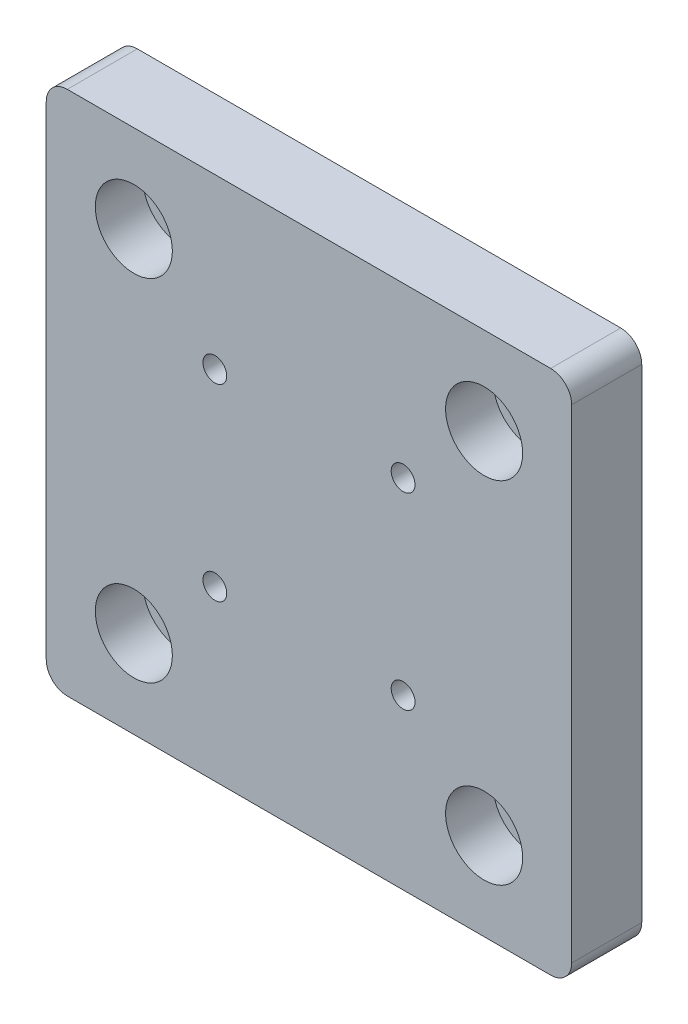
ISO-10303-21;
HEADER;
FILE_DESCRIPTION(('STEP AP214'),'2;1');
FILE_NAME('part.step','',(''),(''),'','','');
FILE_SCHEMA(('AUTOMOTIVE_DESIGN { 1 0 10303 214 1 1 1 1 }'));
ENDSEC;
DATA;
#1=APPLICATION_CONTEXT('core data for automotive mechanical design processes');
#2=APPLICATION_PROTOCOL_DEFINITION('international standard','automotive_design',2000,#1);
#3=PRODUCT_CONTEXT('',#1,'mechanical');
#4=PRODUCT('Part','Part','',(#3));
#5=PRODUCT_RELATED_PRODUCT_CATEGORY('part','',(#4));
#6=PRODUCT_DEFINITION_FORMATION('','',#4);
#7=PRODUCT_DEFINITION_CONTEXT('part definition',#1,'design');
#8=PRODUCT_DEFINITION('design','',#6,#7);
#9=PRODUCT_DEFINITION_SHAPE('','',#8);
#10=(LENGTH_UNIT() NAMED_UNIT(*) SI_UNIT(.MILLI.,.METRE.));
#11=(NAMED_UNIT(*) PLANE_ANGLE_UNIT() SI_UNIT($,.RADIAN.));
#12=(NAMED_UNIT(*) SI_UNIT($,.STERADIAN.) SOLID_ANGLE_UNIT());
#13=UNCERTAINTY_MEASURE_WITH_UNIT(LENGTH_MEASURE(1.E-05),#10,'distance_accuracy_value','');
#14=(GEOMETRIC_REPRESENTATION_CONTEXT(3) GLOBAL_UNCERTAINTY_ASSIGNED_CONTEXT((#13)) GLOBAL_UNIT_ASSIGNED_CONTEXT((#10,
#11,#12)) REPRESENTATION_CONTEXT('',''));
#15=CARTESIAN_POINT('',(0.,0.,0.));
#16=DIRECTION('',(0.,0.,1.));
#17=DIRECTION('',(1.,0.,0.));
#18=AXIS2_PLACEMENT_3D('',#15,#16,#17);
#19=CARTESIAN_POINT('',(37.5,37.5,10.));
#20=DIRECTION('',(-1.,0.,0.));
#21=DIRECTION('',(0.,0.,1.));
#22=AXIS2_PLACEMENT_3D('',#19,#20,#21);
#23=PLANE('',#22);
#24=DIRECTION('',(0.,1.,0.));
#25=VECTOR('',#24,1.);
#26=CARTESIAN_POINT('',(37.5,37.5,10.));
#27=LINE('',#26,#25);
#28=CARTESIAN_POINT('',(37.5,-34.5,10.));
#29=VERTEX_POINT('',#28);
#30=CARTESIAN_POINT('',(37.5,34.5,10.));
#31=VERTEX_POINT('',#30);
#32=EDGE_CURVE('E129',#29,#31,#27,.T.);
#33=ORIENTED_EDGE('',*,*,#32,.F.);
#34=DIRECTION('',(0.,0.,-1.));
#35=VECTOR('',#34,1.);
#36=CARTESIAN_POINT('',(37.5,-34.5,10.));
#37=LINE('',#36,#35);
#38=CARTESIAN_POINT('',(37.5,-34.5,0.));
#39=VERTEX_POINT('',#38);
#40=EDGE_CURVE('E114',#29,#39,#37,.T.);
#41=ORIENTED_EDGE('',*,*,#40,.T.);
#42=DIRECTION('',(0.,1.,0.));
#43=VECTOR('',#42,1.);
#44=CARTESIAN_POINT('',(37.5,37.5,0.));
#45=LINE('',#44,#43);
#46=CARTESIAN_POINT('',(37.5,34.5,0.));
#47=VERTEX_POINT('',#46);
#48=EDGE_CURVE('E126',#39,#47,#45,.T.);
#49=ORIENTED_EDGE('',*,*,#48,.T.);
#50=DIRECTION('',(0.,0.,-1.));
#51=VECTOR('',#50,1.);
#52=CARTESIAN_POINT('',(37.5,34.5,10.));
#53=LINE('',#52,#51);
#54=EDGE_CURVE('E131',#47,#31,#53,.F.);
#55=ORIENTED_EDGE('',*,*,#54,.T.);
#56=EDGE_LOOP('',(#33,#41,#49,#55));
#57=FACE_BOUND('',#56,.T.);
#58=ADVANCED_FACE('F43',(#57),#23,.F.);
#59=CARTESIAN_POINT('',(-37.5,37.5,10.));
#60=DIRECTION('',(0.,-1.,0.));
#61=DIRECTION('',(0.,0.,-1.));
#62=AXIS2_PLACEMENT_3D('',#59,#60,#61);
#63=PLANE('',#62);
#64=DIRECTION('',(-1.,0.,0.));
#65=VECTOR('',#64,1.);
#66=CARTESIAN_POINT('',(-37.5,37.5,10.));
#67=LINE('',#66,#65);
#68=CARTESIAN_POINT('',(34.5,37.5,10.));
#69=VERTEX_POINT('',#68);
#70=CARTESIAN_POINT('',(-34.5,37.5,10.));
#71=VERTEX_POINT('',#70);
#72=EDGE_CURVE('E188',#69,#71,#67,.T.);
#73=ORIENTED_EDGE('',*,*,#72,.F.);
#74=DIRECTION('',(0.,0.,-1.));
#75=VECTOR('',#74,1.);
#76=CARTESIAN_POINT('',(34.5,37.5,10.));
#77=LINE('',#76,#75);
#78=CARTESIAN_POINT('',(34.5,37.5,0.));
#79=VERTEX_POINT('',#78);
#80=EDGE_CURVE('E11',#69,#79,#77,.T.);
#81=ORIENTED_EDGE('',*,*,#80,.T.);
#82=DIRECTION('',(-1.,0.,0.));
#83=VECTOR('',#82,1.);
#84=CARTESIAN_POINT('',(-37.5,37.5,0.));
#85=LINE('',#84,#83);
#86=CARTESIAN_POINT('',(-34.5,37.5,0.));
#87=VERTEX_POINT('',#86);
#88=EDGE_CURVE('E136',#79,#87,#85,.T.);
#89=ORIENTED_EDGE('',*,*,#88,.T.);
#90=DIRECTION('',(0.,0.,-1.));
#91=VECTOR('',#90,1.);
#92=CARTESIAN_POINT('',(-34.5,37.5,10.));
#93=LINE('',#92,#91);
#94=EDGE_CURVE('E51',#87,#71,#93,.F.);
#95=ORIENTED_EDGE('',*,*,#94,.T.);
#96=EDGE_LOOP('',(#73,#81,#89,#95));
#97=FACE_BOUND('',#96,.T.);
#98=ADVANCED_FACE('F187',(#97),#63,.F.);
#99=CARTESIAN_POINT('',(-37.5,37.5,10.));
#100=DIRECTION('',(1.,0.,0.));
#101=DIRECTION('',(0.,1.,0.));
#102=AXIS2_PLACEMENT_3D('',#99,#100,#101);
#103=PLANE('',#102);
#104=DIRECTION('',(0.,-1.,0.));
#105=VECTOR('',#104,1.);
#106=CARTESIAN_POINT('',(-37.5,37.5,0.));
#107=LINE('',#106,#105);
#108=CARTESIAN_POINT('',(-37.5,34.5,0.));
#109=VERTEX_POINT('',#108);
#110=CARTESIAN_POINT('',(-37.5,-34.5,0.));
#111=VERTEX_POINT('',#110);
#112=EDGE_CURVE('E140',#109,#111,#107,.T.);
#113=ORIENTED_EDGE('',*,*,#112,.T.);
#114=DIRECTION('',(0.,0.,-1.));
#115=VECTOR('',#114,1.);
#116=CARTESIAN_POINT('',(-37.5,-34.5,10.));
#117=LINE('',#116,#115);
#118=CARTESIAN_POINT('',(-37.5,-34.5,10.));
#119=VERTEX_POINT('',#118);
#120=EDGE_CURVE('E58',#111,#119,#117,.F.);
#121=ORIENTED_EDGE('',*,*,#120,.T.);
#122=DIRECTION('',(0.,-1.,0.));
#123=VECTOR('',#122,1.);
#124=CARTESIAN_POINT('',(-37.5,37.5,10.));
#125=LINE('',#124,#123);
#126=CARTESIAN_POINT('',(-37.5,34.5,10.));
#127=VERTEX_POINT('',#126);
#128=EDGE_CURVE('E194',#127,#119,#125,.T.);
#129=ORIENTED_EDGE('',*,*,#128,.F.);
#130=DIRECTION('',(0.,0.,-1.));
#131=VECTOR('',#130,1.);
#132=CARTESIAN_POINT('',(-37.5,34.5,10.));
#133=LINE('',#132,#131);
#134=EDGE_CURVE('E181',#127,#109,#133,.T.);
#135=ORIENTED_EDGE('',*,*,#134,.T.);
#136=EDGE_LOOP('',(#113,#121,#129,#135));
#137=FACE_BOUND('',#136,.T.);
#138=ADVANCED_FACE('F198',(#137),#103,.F.);
#139=CARTESIAN_POINT('',(-37.5,-37.5,10.));
#140=DIRECTION('',(0.,1.,0.));
#141=DIRECTION('',(0.,0.,1.));
#142=AXIS2_PLACEMENT_3D('',#139,#140,#141);
#143=PLANE('',#142);
#144=DIRECTION('',(1.,0.,0.));
#145=VECTOR('',#144,1.);
#146=CARTESIAN_POINT('',(-37.5,-37.5,0.));
#147=LINE('',#146,#145);
#148=CARTESIAN_POINT('',(-34.5,-37.5,0.));
#149=VERTEX_POINT('',#148);
#150=CARTESIAN_POINT('',(34.5,-37.5,0.));
#151=VERTEX_POINT('',#150);
#152=EDGE_CURVE('E150',#149,#151,#147,.T.);
#153=ORIENTED_EDGE('',*,*,#152,.T.);
#154=DIRECTION('',(0.,0.,-1.));
#155=VECTOR('',#154,1.);
#156=CARTESIAN_POINT('',(34.5,-37.5,10.));
#157=LINE('',#156,#155);
#158=CARTESIAN_POINT('',(34.5,-37.5,10.));
#159=VERTEX_POINT('',#158);
#160=EDGE_CURVE('E115',#151,#159,#157,.F.);
#161=ORIENTED_EDGE('',*,*,#160,.T.);
#162=DIRECTION('',(1.,0.,0.));
#163=VECTOR('',#162,1.);
#164=CARTESIAN_POINT('',(-37.5,-37.5,10.));
#165=LINE('',#164,#163);
#166=CARTESIAN_POINT('',(-34.5,-37.5,10.));
#167=VERTEX_POINT('',#166);
#168=EDGE_CURVE('E146',#167,#159,#165,.T.);
#169=ORIENTED_EDGE('',*,*,#168,.F.);
#170=DIRECTION('',(0.,0.,-1.));
#171=VECTOR('',#170,1.);
#172=CARTESIAN_POINT('',(-34.5,-37.5,10.));
#173=LINE('',#172,#171);
#174=EDGE_CURVE('E120',#167,#149,#173,.T.);
#175=ORIENTED_EDGE('',*,*,#174,.T.);
#176=EDGE_LOOP('',(#153,#161,#169,#175));
#177=FACE_BOUND('',#176,.T.);
#178=ADVANCED_FACE('F205',(#177),#143,.F.);
#179=CARTESIAN_POINT('',(0.,0.,10.));
#180=DIRECTION('',(0.,0.,1.));
#181=DIRECTION('',(1.,0.,0.));
#182=AXIS2_PLACEMENT_3D('',#179,#180,#181);
#183=PLANE('',#182);
#184=CARTESIAN_POINT('',(-13.4350288425444,-13.4350288425444,10.));
#185=DIRECTION('',(0.,0.,-1.));
#186=DIRECTION('',(-1.,0.,0.));
#187=AXIS2_PLACEMENT_3D('',#184,#185,#186);
#188=CIRCLE('',#187,1.7);
#189=CARTESIAN_POINT('',(-15.1350288425444,-13.4350288425444,10.));
#190=VERTEX_POINT('',#189);
#191=EDGE_CURVE('E273',#190,#190,#188,.T.);
#192=ORIENTED_EDGE('',*,*,#191,.T.);
#193=EDGE_LOOP('',(#192));
#194=FACE_BOUND('',#193,.T.);
#195=CARTESIAN_POINT('',(-13.4350288425444,13.4350288425444,10.));
#196=DIRECTION('',(0.,0.,-1.));
#197=DIRECTION('',(-1.,0.,0.));
#198=AXIS2_PLACEMENT_3D('',#195,#196,#197);
#199=CIRCLE('',#198,1.7);
#200=CARTESIAN_POINT('',(-15.1350288425444,13.4350288425444,10.));
#201=VERTEX_POINT('',#200);
#202=EDGE_CURVE('E261',#201,#201,#199,.T.);
#203=ORIENTED_EDGE('',*,*,#202,.T.);
#204=EDGE_LOOP('',(#203));
#205=FACE_BOUND('',#204,.T.);
#206=CARTESIAN_POINT('',(13.4350288425444,13.4350288425444,10.));
#207=DIRECTION('',(0.,0.,-1.));
#208=DIRECTION('',(-1.,0.,0.));
#209=AXIS2_PLACEMENT_3D('',#206,#207,#208);
#210=CIRCLE('',#209,1.7);
#211=CARTESIAN_POINT('',(11.7350288425444,13.4350288425444,10.));
#212=VERTEX_POINT('',#211);
#213=EDGE_CURVE('E249',#212,#212,#210,.T.);
#214=ORIENTED_EDGE('',*,*,#213,.T.);
#215=EDGE_LOOP('',(#214));
#216=FACE_BOUND('',#215,.T.);
#217=CARTESIAN_POINT('',(13.4350288425444,-13.4350288425444,10.));
#218=DIRECTION('',(0.,0.,-1.));
#219=DIRECTION('',(-1.,0.,0.));
#220=AXIS2_PLACEMENT_3D('',#217,#218,#219);
#221=CIRCLE('',#220,1.7);
#222=CARTESIAN_POINT('',(11.7350288425444,-13.4350288425444,10.));
#223=VERTEX_POINT('',#222);
#224=EDGE_CURVE('E237',#223,#223,#221,.T.);
#225=ORIENTED_EDGE('',*,*,#224,.T.);
#226=EDGE_LOOP('',(#225));
#227=FACE_BOUND('',#226,.T.);
#228=CARTESIAN_POINT('',(-25.,25.,10.));
#229=DIRECTION('',(0.,0.,1.));
#230=DIRECTION('',(1.,0.,0.));
#231=AXIS2_PLACEMENT_3D('',#228,#229,#230);
#232=CIRCLE('',#231,5.5);
#233=CARTESIAN_POINT('',(-19.5,25.,10.));
#234=VERTEX_POINT('',#233);
#235=EDGE_CURVE('E234',#234,#234,#232,.T.);
#236=ORIENTED_EDGE('',*,*,#235,.F.);
#237=EDGE_LOOP('',(#236));
#238=FACE_BOUND('',#237,.T.);
#239=CARTESIAN_POINT('',(-25.,-25.,10.));
#240=DIRECTION('',(0.,0.,1.));
#241=DIRECTION('',(1.,0.,0.));
#242=AXIS2_PLACEMENT_3D('',#239,#240,#241);
#243=CIRCLE('',#242,5.5);
#244=CARTESIAN_POINT('',(-19.5,-25.,10.));
#245=VERTEX_POINT('',#244);
#246=EDGE_CURVE('E165',#245,#245,#243,.T.);
#247=ORIENTED_EDGE('',*,*,#246,.F.);
#248=EDGE_LOOP('',(#247));
#249=FACE_BOUND('',#248,.T.);
#250=CARTESIAN_POINT('',(25.,-25.,10.));
#251=DIRECTION('',(0.,0.,1.));
#252=DIRECTION('',(1.,0.,0.));
#253=AXIS2_PLACEMENT_3D('',#250,#251,#252);
#254=CIRCLE('',#253,5.5);
#255=CARTESIAN_POINT('',(30.5,-25.,10.));
#256=VERTEX_POINT('',#255);
#257=EDGE_CURVE('E160',#256,#256,#254,.T.);
#258=ORIENTED_EDGE('',*,*,#257,.F.);
#259=EDGE_LOOP('',(#258));
#260=FACE_BOUND('',#259,.T.);
#261=CARTESIAN_POINT('',(25.,25.,10.));
#262=DIRECTION('',(0.,0.,1.));
#263=DIRECTION('',(1.,0.,0.));
#264=AXIS2_PLACEMENT_3D('',#261,#262,#263);
#265=CIRCLE('',#264,5.5);
#266=CARTESIAN_POINT('',(30.5,25.,10.));
#267=VERTEX_POINT('',#266);
#268=EDGE_CURVE('E155',#267,#267,#265,.T.);
#269=ORIENTED_EDGE('',*,*,#268,.F.);
#270=EDGE_LOOP('',(#269));
#271=FACE_BOUND('',#270,.T.);
#272=ORIENTED_EDGE('',*,*,#168,.T.);
#273=CARTESIAN_POINT('',(34.5,-34.5,10.));
#274=DIRECTION('',(0.,0.,1.));
#275=DIRECTION('',(1.,0.,0.));
#276=AXIS2_PLACEMENT_3D('',#273,#274,#275);
#277=CIRCLE('',#276,3.);
#278=EDGE_CURVE('E179',#159,#29,#277,.T.);
#279=ORIENTED_EDGE('',*,*,#278,.T.);
#280=ORIENTED_EDGE('',*,*,#32,.T.);
#281=CARTESIAN_POINT('',(34.5,34.5,10.));
#282=DIRECTION('',(0.,0.,1.));
#283=DIRECTION('',(1.,0.,0.));
#284=AXIS2_PLACEMENT_3D('',#281,#282,#283);
#285=CIRCLE('',#284,3.);
#286=EDGE_CURVE('E175',#31,#69,#285,.T.);
#287=ORIENTED_EDGE('',*,*,#286,.T.);
#288=ORIENTED_EDGE('',*,*,#72,.T.);
#289=CARTESIAN_POINT('',(-34.5,34.5,10.));
#290=DIRECTION('',(0.,0.,1.));
#291=DIRECTION('',(1.,0.,0.));
#292=AXIS2_PLACEMENT_3D('',#289,#290,#291);
#293=CIRCLE('',#292,3.);
#294=EDGE_CURVE('E65',#71,#127,#293,.T.);
#295=ORIENTED_EDGE('',*,*,#294,.T.);
#296=ORIENTED_EDGE('',*,*,#128,.T.);
#297=CARTESIAN_POINT('',(-34.5,-34.5,10.));
#298=DIRECTION('',(0.,0.,1.));
#299=DIRECTION('',(1.,0.,0.));
#300=AXIS2_PLACEMENT_3D('',#297,#298,#299);
#301=CIRCLE('',#300,3.);
#302=EDGE_CURVE('E177',#119,#167,#301,.T.);
#303=ORIENTED_EDGE('',*,*,#302,.T.);
#304=EDGE_LOOP('',(#272,#279,#280,#287,#288,#295,#296,#303));
#305=FACE_BOUND('',#304,.T.);
#306=ADVANCED_FACE('F192',(#194,#205,#216,#227,#238,#249,#260,#271,#305),#183,.T.);
#307=CARTESIAN_POINT('',(0.,0.,0.));
#308=DIRECTION('',(0.,0.,1.));
#309=DIRECTION('',(1.,0.,0.));
#310=AXIS2_PLACEMENT_3D('',#307,#308,#309);
#311=PLANE('',#310);
#312=CARTESIAN_POINT('',(-13.4350288425444,-13.4350288425444,0.));
#313=DIRECTION('',(0.,0.,-1.));
#314=DIRECTION('',(-1.,0.,0.));
#315=AXIS2_PLACEMENT_3D('',#312,#313,#314);
#316=CIRCLE('',#315,3.);
#317=CARTESIAN_POINT('',(-16.4350288425444,-13.4350288425444,0.));
#318=VERTEX_POINT('',#317);
#319=EDGE_CURVE('E282',#318,#318,#316,.T.);
#320=ORIENTED_EDGE('',*,*,#319,.F.);
#321=EDGE_LOOP('',(#320));
#322=FACE_BOUND('',#321,.T.);
#323=CARTESIAN_POINT('',(-13.4350288425444,13.4350288425444,0.));
#324=DIRECTION('',(0.,0.,-1.));
#325=DIRECTION('',(-1.,0.,0.));
#326=AXIS2_PLACEMENT_3D('',#323,#324,#325);
#327=CIRCLE('',#326,3.);
#328=CARTESIAN_POINT('',(-16.4350288425444,13.4350288425444,0.));
#329=VERTEX_POINT('',#328);
#330=EDGE_CURVE('E270',#329,#329,#327,.T.);
#331=ORIENTED_EDGE('',*,*,#330,.F.);
#332=EDGE_LOOP('',(#331));
#333=FACE_BOUND('',#332,.T.);
#334=CARTESIAN_POINT('',(13.4350288425444,13.4350288425444,0.));
#335=DIRECTION('',(0.,0.,-1.));
#336=DIRECTION('',(-1.,0.,0.));
#337=AXIS2_PLACEMENT_3D('',#334,#335,#336);
#338=CIRCLE('',#337,2.99999999999999);
#339=CARTESIAN_POINT('',(10.4350288425444,13.4350288425444,0.));
#340=VERTEX_POINT('',#339);
#341=EDGE_CURVE('E258',#340,#340,#338,.T.);
#342=ORIENTED_EDGE('',*,*,#341,.F.);
#343=EDGE_LOOP('',(#342));
#344=FACE_BOUND('',#343,.T.);
#345=CARTESIAN_POINT('',(13.4350288425444,-13.4350288425444,0.));
#346=DIRECTION('',(0.,0.,-1.));
#347=DIRECTION('',(-1.,0.,0.));
#348=AXIS2_PLACEMENT_3D('',#345,#346,#347);
#349=CIRCLE('',#348,2.99999999999999);
#350=CARTESIAN_POINT('',(10.4350288425444,-13.4350288425444,0.));
#351=VERTEX_POINT('',#350);
#352=EDGE_CURVE('E246',#351,#351,#349,.T.);
#353=ORIENTED_EDGE('',*,*,#352,.F.);
#354=EDGE_LOOP('',(#353));
#355=FACE_BOUND('',#354,.T.);
#356=CARTESIAN_POINT('',(-25.,25.,0.));
#357=DIRECTION('',(0.,0.,1.));
#358=DIRECTION('',(1.,0.,0.));
#359=AXIS2_PLACEMENT_3D('',#356,#357,#358);
#360=CIRCLE('',#359,3.3);
#361=CARTESIAN_POINT('',(-21.7,25.,0.));
#362=VERTEX_POINT('',#361);
#363=EDGE_CURVE('E162',#362,#362,#360,.T.);
#364=ORIENTED_EDGE('',*,*,#363,.T.);
#365=EDGE_LOOP('',(#364));
#366=FACE_BOUND('',#365,.T.);
#367=CARTESIAN_POINT('',(-25.,-25.,0.));
#368=DIRECTION('',(0.,0.,1.));
#369=DIRECTION('',(1.,0.,0.));
#370=AXIS2_PLACEMENT_3D('',#367,#368,#369);
#371=CIRCLE('',#370,3.3);
#372=CARTESIAN_POINT('',(-21.7,-25.,0.));
#373=VERTEX_POINT('',#372);
#374=EDGE_CURVE('E157',#373,#373,#371,.T.);
#375=ORIENTED_EDGE('',*,*,#374,.T.);
#376=EDGE_LOOP('',(#375));
#377=FACE_BOUND('',#376,.T.);
#378=CARTESIAN_POINT('',(25.,-25.,0.));
#379=DIRECTION('',(0.,0.,1.));
#380=DIRECTION('',(1.,0.,0.));
#381=AXIS2_PLACEMENT_3D('',#378,#379,#380);
#382=CIRCLE('',#381,3.3);
#383=CARTESIAN_POINT('',(28.3,-25.,0.));
#384=VERTEX_POINT('',#383);
#385=EDGE_CURVE('E152',#384,#384,#382,.T.);
#386=ORIENTED_EDGE('',*,*,#385,.T.);
#387=EDGE_LOOP('',(#386));
#388=FACE_BOUND('',#387,.T.);
#389=CARTESIAN_POINT('',(25.,25.,0.));
#390=DIRECTION('',(0.,0.,1.));
#391=DIRECTION('',(1.,0.,0.));
#392=AXIS2_PLACEMENT_3D('',#389,#390,#391);
#393=CIRCLE('',#392,3.3);
#394=CARTESIAN_POINT('',(28.3,25.,0.));
#395=VERTEX_POINT('',#394);
#396=EDGE_CURVE('E137',#395,#395,#393,.T.);
#397=ORIENTED_EDGE('',*,*,#396,.T.);
#398=EDGE_LOOP('',(#397));
#399=FACE_BOUND('',#398,.T.);
#400=ORIENTED_EDGE('',*,*,#48,.F.);
#401=CARTESIAN_POINT('',(34.5,-34.5,0.));
#402=DIRECTION('',(0.,0.,1.));
#403=DIRECTION('',(1.,0.,0.));
#404=AXIS2_PLACEMENT_3D('',#401,#402,#403);
#405=CIRCLE('',#404,3.);
#406=EDGE_CURVE('E110',#39,#151,#405,.F.);
#407=ORIENTED_EDGE('',*,*,#406,.T.);
#408=ORIENTED_EDGE('',*,*,#152,.F.);
#409=CARTESIAN_POINT('',(-34.5,-34.5,0.));
#410=DIRECTION('',(0.,0.,1.));
#411=DIRECTION('',(1.,0.,0.));
#412=AXIS2_PLACEMENT_3D('',#409,#410,#411);
#413=CIRCLE('',#412,3.);
#414=EDGE_CURVE('E121',#149,#111,#413,.F.);
#415=ORIENTED_EDGE('',*,*,#414,.T.);
#416=ORIENTED_EDGE('',*,*,#112,.F.);
#417=CARTESIAN_POINT('',(-34.5,34.5,0.));
#418=DIRECTION('',(0.,0.,1.));
#419=DIRECTION('',(1.,0.,0.));
#420=AXIS2_PLACEMENT_3D('',#417,#418,#419);
#421=CIRCLE('',#420,3.);
#422=EDGE_CURVE('E130',#109,#87,#421,.F.);
#423=ORIENTED_EDGE('',*,*,#422,.T.);
#424=ORIENTED_EDGE('',*,*,#88,.F.);
#425=CARTESIAN_POINT('',(34.5,34.5,0.));
#426=DIRECTION('',(0.,0.,1.));
#427=DIRECTION('',(1.,0.,0.));
#428=AXIS2_PLACEMENT_3D('',#425,#426,#427);
#429=CIRCLE('',#428,3.);
#430=EDGE_CURVE('E135',#79,#47,#429,.F.);
#431=ORIENTED_EDGE('',*,*,#430,.T.);
#432=EDGE_LOOP('',(#400,#407,#408,#415,#416,#423,#424,#431));
#433=FACE_BOUND('',#432,.T.);
#434=ADVANCED_FACE('F133',(#322,#333,#344,#355,#366,#377,#388,#399,#433),#311,.F.);
#435=CARTESIAN_POINT('',(25.,25.,10.));
#436=DIRECTION('',(0.,0.,1.));
#437=DIRECTION('',(1.,0.,0.));
#438=AXIS2_PLACEMENT_3D('',#435,#436,#437);
#439=CYLINDRICAL_SURFACE('',#438,3.3);
#440=CARTESIAN_POINT('',(25.,25.,3.2));
#441=DIRECTION('',(0.,0.,1.));
#442=DIRECTION('',(1.,0.,0.));
#443=AXIS2_PLACEMENT_3D('',#440,#441,#442);
#444=CIRCLE('',#443,3.3);
#445=CARTESIAN_POINT('',(28.3,25.,3.2));
#446=VERTEX_POINT('',#445);
#447=EDGE_CURVE('E143',#446,#446,#444,.T.);
#448=ORIENTED_EDGE('',*,*,#447,.T.);
#449=EDGE_LOOP('',(#448));
#450=FACE_BOUND('',#449,.T.);
#451=ORIENTED_EDGE('',*,*,#396,.F.);
#452=EDGE_LOOP('',(#451));
#453=FACE_BOUND('',#452,.T.);
#454=ADVANCED_FACE('F290',(#450,#453),#439,.F.);
#455=CARTESIAN_POINT('',(28.3,25.,3.2));
#456=DIRECTION('',(0.,0.,-1.));
#457=DIRECTION('',(-1.,0.,0.));
#458=AXIS2_PLACEMENT_3D('',#455,#456,#457);
#459=PLANE('',#458);
#460=ORIENTED_EDGE('',*,*,#447,.F.);
#461=EDGE_LOOP('',(#460));
#462=FACE_BOUND('',#461,.T.);
#463=CARTESIAN_POINT('',(25.,25.,3.2));
#464=DIRECTION('',(0.,0.,1.));
#465=DIRECTION('',(1.,0.,0.));
#466=AXIS2_PLACEMENT_3D('',#463,#464,#465);
#467=CIRCLE('',#466,5.5);
#468=CARTESIAN_POINT('',(30.5,25.,3.2));
#469=VERTEX_POINT('',#468);
#470=EDGE_CURVE('E210',#469,#469,#467,.T.);
#471=ORIENTED_EDGE('',*,*,#470,.T.);
#472=EDGE_LOOP('',(#471));
#473=FACE_BOUND('',#472,.T.);
#474=ADVANCED_FACE('F307',(#462,#473),#459,.F.);
#475=CARTESIAN_POINT('',(25.,25.,10.));
#476=DIRECTION('',(0.,0.,1.));
#477=DIRECTION('',(1.,0.,0.));
#478=AXIS2_PLACEMENT_3D('',#475,#476,#477);
#479=CYLINDRICAL_SURFACE('',#478,5.5);
#480=ORIENTED_EDGE('',*,*,#470,.F.);
#481=EDGE_LOOP('',(#480));
#482=FACE_BOUND('',#481,.T.);
#483=ORIENTED_EDGE('',*,*,#268,.T.);
#484=EDGE_LOOP('',(#483));
#485=FACE_BOUND('',#484,.T.);
#486=ADVANCED_FACE('F313',(#482,#485),#479,.F.);
#487=CARTESIAN_POINT('',(25.,-25.,10.));
#488=DIRECTION('',(0.,0.,1.));
#489=DIRECTION('',(1.,0.,0.));
#490=AXIS2_PLACEMENT_3D('',#487,#488,#489);
#491=CYLINDRICAL_SURFACE('',#490,3.3);
#492=CARTESIAN_POINT('',(25.,-25.,3.2));
#493=DIRECTION('',(0.,0.,1.));
#494=DIRECTION('',(1.,0.,0.));
#495=AXIS2_PLACEMENT_3D('',#492,#493,#494);
#496=CIRCLE('',#495,3.3);
#497=CARTESIAN_POINT('',(28.3,-25.,3.2));
#498=VERTEX_POINT('',#497);
#499=EDGE_CURVE('E156',#498,#498,#496,.T.);
#500=ORIENTED_EDGE('',*,*,#499,.T.);
#501=EDGE_LOOP('',(#500));
#502=FACE_BOUND('',#501,.T.);
#503=ORIENTED_EDGE('',*,*,#385,.F.);
#504=EDGE_LOOP('',(#503));
#505=FACE_BOUND('',#504,.T.);
#506=ADVANCED_FACE('F383',(#502,#505),#491,.F.);
#507=CARTESIAN_POINT('',(28.3,-25.,3.2));
#508=DIRECTION('',(0.,0.,-1.));
#509=DIRECTION('',(-1.,0.,0.));
#510=AXIS2_PLACEMENT_3D('',#507,#508,#509);
#511=PLANE('',#510);
#512=ORIENTED_EDGE('',*,*,#499,.F.);
#513=EDGE_LOOP('',(#512));
#514=FACE_BOUND('',#513,.T.);
#515=CARTESIAN_POINT('',(25.,-25.,3.2));
#516=DIRECTION('',(0.,0.,1.));
#517=DIRECTION('',(1.,0.,0.));
#518=AXIS2_PLACEMENT_3D('',#515,#516,#517);
#519=CIRCLE('',#518,5.5);
#520=CARTESIAN_POINT('',(30.5,-25.,3.2));
#521=VERTEX_POINT('',#520);
#522=EDGE_CURVE('E217',#521,#521,#519,.T.);
#523=ORIENTED_EDGE('',*,*,#522,.T.);
#524=EDGE_LOOP('',(#523));
#525=FACE_BOUND('',#524,.T.);
#526=ADVANCED_FACE('F379',(#514,#525),#511,.F.);
#527=CARTESIAN_POINT('',(25.,-25.,10.));
#528=DIRECTION('',(0.,0.,1.));
#529=DIRECTION('',(1.,0.,0.));
#530=AXIS2_PLACEMENT_3D('',#527,#528,#529);
#531=CYLINDRICAL_SURFACE('',#530,5.5);
#532=ORIENTED_EDGE('',*,*,#522,.F.);
#533=EDGE_LOOP('',(#532));
#534=FACE_BOUND('',#533,.T.);
#535=ORIENTED_EDGE('',*,*,#257,.T.);
#536=EDGE_LOOP('',(#535));
#537=FACE_BOUND('',#536,.T.);
#538=ADVANCED_FACE('F375',(#534,#537),#531,.F.);
#539=CARTESIAN_POINT('',(-25.,-25.,10.));
#540=DIRECTION('',(0.,0.,1.));
#541=DIRECTION('',(1.,0.,0.));
#542=AXIS2_PLACEMENT_3D('',#539,#540,#541);
#543=CYLINDRICAL_SURFACE('',#542,3.3);
#544=CARTESIAN_POINT('',(-25.,-25.,3.2));
#545=DIRECTION('',(0.,0.,1.));
#546=DIRECTION('',(1.,0.,0.));
#547=AXIS2_PLACEMENT_3D('',#544,#545,#546);
#548=CIRCLE('',#547,3.3);
#549=CARTESIAN_POINT('',(-21.7,-25.,3.2));
#550=VERTEX_POINT('',#549);
#551=EDGE_CURVE('E161',#550,#550,#548,.T.);
#552=ORIENTED_EDGE('',*,*,#551,.T.);
#553=EDGE_LOOP('',(#552));
#554=FACE_BOUND('',#553,.T.);
#555=ORIENTED_EDGE('',*,*,#374,.F.);
#556=EDGE_LOOP('',(#555));
#557=FACE_BOUND('',#556,.T.);
#558=ADVANCED_FACE('F371',(#554,#557),#543,.F.);
#559=CARTESIAN_POINT('',(-21.7,-25.,3.2));
#560=DIRECTION('',(0.,0.,-1.));
#561=DIRECTION('',(-1.,0.,0.));
#562=AXIS2_PLACEMENT_3D('',#559,#560,#561);
#563=PLANE('',#562);
#564=ORIENTED_EDGE('',*,*,#551,.F.);
#565=EDGE_LOOP('',(#564));
#566=FACE_BOUND('',#565,.T.);
#567=CARTESIAN_POINT('',(-25.,-25.,3.2));
#568=DIRECTION('',(0.,0.,1.));
#569=DIRECTION('',(1.,0.,0.));
#570=AXIS2_PLACEMENT_3D('',#567,#568,#569);
#571=CIRCLE('',#570,5.5);
#572=CARTESIAN_POINT('',(-19.5,-25.,3.2));
#573=VERTEX_POINT('',#572);
#574=EDGE_CURVE('E224',#573,#573,#571,.T.);
#575=ORIENTED_EDGE('',*,*,#574,.T.);
#576=EDGE_LOOP('',(#575));
#577=FACE_BOUND('',#576,.T.);
#578=ADVANCED_FACE('F367',(#566,#577),#563,.F.);
#579=CARTESIAN_POINT('',(-25.,-25.,10.));
#580=DIRECTION('',(0.,0.,1.));
#581=DIRECTION('',(1.,0.,0.));
#582=AXIS2_PLACEMENT_3D('',#579,#580,#581);
#583=CYLINDRICAL_SURFACE('',#582,5.5);
#584=ORIENTED_EDGE('',*,*,#574,.F.);
#585=EDGE_LOOP('',(#584));
#586=FACE_BOUND('',#585,.T.);
#587=ORIENTED_EDGE('',*,*,#246,.T.);
#588=EDGE_LOOP('',(#587));
#589=FACE_BOUND('',#588,.T.);
#590=ADVANCED_FACE('F363',(#586,#589),#583,.F.);
#591=CARTESIAN_POINT('',(-25.,25.,10.));
#592=DIRECTION('',(0.,0.,1.));
#593=DIRECTION('',(1.,0.,0.));
#594=AXIS2_PLACEMENT_3D('',#591,#592,#593);
#595=CYLINDRICAL_SURFACE('',#594,3.3);
#596=CARTESIAN_POINT('',(-25.,25.,3.2));
#597=DIRECTION('',(0.,0.,1.));
#598=DIRECTION('',(1.,0.,0.));
#599=AXIS2_PLACEMENT_3D('',#596,#597,#598);
#600=CIRCLE('',#599,3.3);
#601=CARTESIAN_POINT('',(-21.7,25.,3.2));
#602=VERTEX_POINT('',#601);
#603=EDGE_CURVE('E166',#602,#602,#600,.T.);
#604=ORIENTED_EDGE('',*,*,#603,.T.);
#605=EDGE_LOOP('',(#604));
#606=FACE_BOUND('',#605,.T.);
#607=ORIENTED_EDGE('',*,*,#363,.F.);
#608=EDGE_LOOP('',(#607));
#609=FACE_BOUND('',#608,.T.);
#610=ADVANCED_FACE('F359',(#606,#609),#595,.F.);
#611=CARTESIAN_POINT('',(-21.7,25.,3.2));
#612=DIRECTION('',(0.,0.,-1.));
#613=DIRECTION('',(-1.,0.,0.));
#614=AXIS2_PLACEMENT_3D('',#611,#612,#613);
#615=PLANE('',#614);
#616=ORIENTED_EDGE('',*,*,#603,.F.);
#617=EDGE_LOOP('',(#616));
#618=FACE_BOUND('',#617,.T.);
#619=CARTESIAN_POINT('',(-25.,25.,3.2));
#620=DIRECTION('',(0.,0.,1.));
#621=DIRECTION('',(1.,0.,0.));
#622=AXIS2_PLACEMENT_3D('',#619,#620,#621);
#623=CIRCLE('',#622,5.5);
#624=CARTESIAN_POINT('',(-19.5,25.,3.2));
#625=VERTEX_POINT('',#624);
#626=EDGE_CURVE('E231',#625,#625,#623,.T.);
#627=ORIENTED_EDGE('',*,*,#626,.T.);
#628=EDGE_LOOP('',(#627));
#629=FACE_BOUND('',#628,.T.);
#630=ADVANCED_FACE('F355',(#618,#629),#615,.F.);
#631=CARTESIAN_POINT('',(-25.,25.,10.));
#632=DIRECTION('',(0.,0.,1.));
#633=DIRECTION('',(1.,0.,0.));
#634=AXIS2_PLACEMENT_3D('',#631,#632,#633);
#635=CYLINDRICAL_SURFACE('',#634,5.5);
#636=ORIENTED_EDGE('',*,*,#626,.F.);
#637=EDGE_LOOP('',(#636));
#638=FACE_BOUND('',#637,.T.);
#639=ORIENTED_EDGE('',*,*,#235,.T.);
#640=EDGE_LOOP('',(#639));
#641=FACE_BOUND('',#640,.T.);
#642=ADVANCED_FACE('F328',(#638,#641),#635,.F.);
#643=CARTESIAN_POINT('',(34.5,-34.5,10.));
#644=DIRECTION('',(0.,0.,-1.));
#645=DIRECTION('',(-1.,0.,0.));
#646=AXIS2_PLACEMENT_3D('',#643,#644,#645);
#647=CYLINDRICAL_SURFACE('',#646,3.);
#648=ORIENTED_EDGE('',*,*,#278,.F.);
#649=ORIENTED_EDGE('',*,*,#160,.F.);
#650=ORIENTED_EDGE('',*,*,#406,.F.);
#651=ORIENTED_EDGE('',*,*,#40,.F.);
#652=EDGE_LOOP('',(#648,#649,#650,#651));
#653=FACE_BOUND('',#652,.T.);
#654=ADVANCED_FACE('F113',(#653),#647,.T.);
#655=CARTESIAN_POINT('',(-34.5,-34.5,10.));
#656=DIRECTION('',(0.,0.,-1.));
#657=DIRECTION('',(-1.,0.,0.));
#658=AXIS2_PLACEMENT_3D('',#655,#656,#657);
#659=CYLINDRICAL_SURFACE('',#658,3.);
#660=ORIENTED_EDGE('',*,*,#302,.F.);
#661=ORIENTED_EDGE('',*,*,#120,.F.);
#662=ORIENTED_EDGE('',*,*,#414,.F.);
#663=ORIENTED_EDGE('',*,*,#174,.F.);
#664=EDGE_LOOP('',(#660,#661,#662,#663));
#665=FACE_BOUND('',#664,.T.);
#666=ADVANCED_FACE('F202',(#665),#659,.T.);
#667=CARTESIAN_POINT('',(34.5,34.5,10.));
#668=DIRECTION('',(0.,0.,-1.));
#669=DIRECTION('',(-1.,0.,0.));
#670=AXIS2_PLACEMENT_3D('',#667,#668,#669);
#671=CYLINDRICAL_SURFACE('',#670,3.);
#672=ORIENTED_EDGE('',*,*,#286,.F.);
#673=ORIENTED_EDGE('',*,*,#54,.F.);
#674=ORIENTED_EDGE('',*,*,#430,.F.);
#675=ORIENTED_EDGE('',*,*,#80,.F.);
#676=EDGE_LOOP('',(#672,#673,#674,#675));
#677=FACE_BOUND('',#676,.T.);
#678=ADVANCED_FACE('F330',(#677),#671,.T.);
#679=CARTESIAN_POINT('',(-34.5,34.5,10.));
#680=DIRECTION('',(0.,0.,-1.));
#681=DIRECTION('',(-1.,0.,0.));
#682=AXIS2_PLACEMENT_3D('',#679,#680,#681);
#683=CYLINDRICAL_SURFACE('',#682,3.);
#684=ORIENTED_EDGE('',*,*,#294,.F.);
#685=ORIENTED_EDGE('',*,*,#94,.F.);
#686=ORIENTED_EDGE('',*,*,#422,.F.);
#687=ORIENTED_EDGE('',*,*,#134,.F.);
#688=EDGE_LOOP('',(#684,#685,#686,#687));
#689=FACE_BOUND('',#688,.T.);
#690=ADVANCED_FACE('F45',(#689),#683,.T.);
#691=CARTESIAN_POINT('',(13.4350288425444,-13.4350288425444,0.));
#692=DIRECTION('',(0.,0.,-1.));
#693=DIRECTION('',(-1.,0.,0.));
#694=AXIS2_PLACEMENT_3D('',#691,#692,#693);
#695=CYLINDRICAL_SURFACE('',#694,1.7);
#696=ORIENTED_EDGE('',*,*,#224,.F.);
#697=EDGE_LOOP('',(#696));
#698=FACE_BOUND('',#697,.T.);
#699=CARTESIAN_POINT('',(13.4350288425444,-13.4350288425444,3.4));
#700=DIRECTION('',(0.,0.,-1.));
#701=DIRECTION('',(-1.,0.,0.));
#702=AXIS2_PLACEMENT_3D('',#699,#700,#701);
#703=CIRCLE('',#702,1.7);
#704=CARTESIAN_POINT('',(11.7350288425444,-13.4350288425444,3.4));
#705=VERTEX_POINT('',#704);
#706=EDGE_CURVE('E240',#705,#705,#703,.T.);
#707=ORIENTED_EDGE('',*,*,#706,.T.);
#708=EDGE_LOOP('',(#707));
#709=FACE_BOUND('',#708,.T.);
#710=ADVANCED_FACE('F336',(#698,#709),#695,.F.);
#711=CARTESIAN_POINT('',(15.1350288425444,-13.4350288425444,3.4));
#712=DIRECTION('',(0.,0.,1.));
#713=DIRECTION('',(1.,0.,0.));
#714=AXIS2_PLACEMENT_3D('',#711,#712,#713);
#715=PLANE('',#714);
#716=ORIENTED_EDGE('',*,*,#706,.F.);
#717=EDGE_LOOP('',(#716));
#718=FACE_BOUND('',#717,.T.);
#719=CARTESIAN_POINT('',(13.4350288425444,-13.4350288425444,3.4));
#720=DIRECTION('',(0.,0.,-1.));
#721=DIRECTION('',(-1.,0.,0.));
#722=AXIS2_PLACEMENT_3D('',#719,#720,#721);
#723=CIRCLE('',#722,2.99999999999999);
#724=CARTESIAN_POINT('',(10.4350288425444,-13.4350288425444,3.4));
#725=VERTEX_POINT('',#724);
#726=EDGE_CURVE('E243',#725,#725,#723,.T.);
#727=ORIENTED_EDGE('',*,*,#726,.T.);
#728=EDGE_LOOP('',(#727));
#729=FACE_BOUND('',#728,.T.);
#730=ADVANCED_FACE('F341',(#718,#729),#715,.F.);
#731=CARTESIAN_POINT('',(13.4350288425444,-13.4350288425444,0.));
#732=DIRECTION('',(0.,0.,-1.));
#733=DIRECTION('',(-1.,0.,0.));
#734=AXIS2_PLACEMENT_3D('',#731,#732,#733);
#735=CYLINDRICAL_SURFACE('',#734,2.99999999999999);
#736=ORIENTED_EDGE('',*,*,#726,.F.);
#737=EDGE_LOOP('',(#736));
#738=FACE_BOUND('',#737,.T.);
#739=ORIENTED_EDGE('',*,*,#352,.T.);
#740=EDGE_LOOP('',(#739));
#741=FACE_BOUND('',#740,.T.);
#742=ADVANCED_FACE('F347',(#738,#741),#735,.F.);
#743=CARTESIAN_POINT('',(13.4350288425444,13.4350288425444,0.));
#744=DIRECTION('',(0.,0.,-1.));
#745=DIRECTION('',(-1.,0.,0.));
#746=AXIS2_PLACEMENT_3D('',#743,#744,#745);
#747=CYLINDRICAL_SURFACE('',#746,1.7);
#748=ORIENTED_EDGE('',*,*,#213,.F.);
#749=EDGE_LOOP('',(#748));
#750=FACE_BOUND('',#749,.T.);
#751=CARTESIAN_POINT('',(13.4350288425444,13.4350288425444,3.4));
#752=DIRECTION('',(0.,0.,-1.));
#753=DIRECTION('',(-1.,0.,0.));
#754=AXIS2_PLACEMENT_3D('',#751,#752,#753);
#755=CIRCLE('',#754,1.7);
#756=CARTESIAN_POINT('',(11.7350288425444,13.4350288425444,3.4));
#757=VERTEX_POINT('',#756);
#758=EDGE_CURVE('E252',#757,#757,#755,.T.);
#759=ORIENTED_EDGE('',*,*,#758,.T.);
#760=EDGE_LOOP('',(#759));
#761=FACE_BOUND('',#760,.T.);
#762=ADVANCED_FACE('F451',(#750,#761),#747,.F.);
#763=CARTESIAN_POINT('',(15.1350288425444,13.4350288425444,3.4));
#764=DIRECTION('',(0.,0.,1.));
#765=DIRECTION('',(1.,0.,0.));
#766=AXIS2_PLACEMENT_3D('',#763,#764,#765);
#767=PLANE('',#766);
#768=ORIENTED_EDGE('',*,*,#758,.F.);
#769=EDGE_LOOP('',(#768));
#770=FACE_BOUND('',#769,.T.);
#771=CARTESIAN_POINT('',(13.4350288425444,13.4350288425444,3.4));
#772=DIRECTION('',(0.,0.,-1.));
#773=DIRECTION('',(-1.,0.,0.));
#774=AXIS2_PLACEMENT_3D('',#771,#772,#773);
#775=CIRCLE('',#774,2.99999999999999);
#776=CARTESIAN_POINT('',(10.4350288425444,13.4350288425444,3.4));
#777=VERTEX_POINT('',#776);
#778=EDGE_CURVE('E255',#777,#777,#775,.T.);
#779=ORIENTED_EDGE('',*,*,#778,.T.);
#780=EDGE_LOOP('',(#779));
#781=FACE_BOUND('',#780,.T.);
#782=ADVANCED_FACE('F460',(#770,#781),#767,.F.);
#783=CARTESIAN_POINT('',(13.4350288425444,13.4350288425444,0.));
#784=DIRECTION('',(0.,0.,-1.));
#785=DIRECTION('',(-1.,0.,0.));
#786=AXIS2_PLACEMENT_3D('',#783,#784,#785);
#787=CYLINDRICAL_SURFACE('',#786,2.99999999999999);
#788=ORIENTED_EDGE('',*,*,#778,.F.);
#789=EDGE_LOOP('',(#788));
#790=FACE_BOUND('',#789,.T.);
#791=ORIENTED_EDGE('',*,*,#341,.T.);
#792=EDGE_LOOP('',(#791));
#793=FACE_BOUND('',#792,.T.);
#794=ADVANCED_FACE('F470',(#790,#793),#787,.F.);
#795=CARTESIAN_POINT('',(-13.4350288425444,13.4350288425444,0.));
#796=DIRECTION('',(0.,0.,-1.));
#797=DIRECTION('',(-1.,0.,0.));
#798=AXIS2_PLACEMENT_3D('',#795,#796,#797);
#799=CYLINDRICAL_SURFACE('',#798,1.7);
#800=ORIENTED_EDGE('',*,*,#202,.F.);
#801=EDGE_LOOP('',(#800));
#802=FACE_BOUND('',#801,.T.);
#803=CARTESIAN_POINT('',(-13.4350288425444,13.4350288425444,3.4));
#804=DIRECTION('',(0.,0.,-1.));
#805=DIRECTION('',(-1.,0.,0.));
#806=AXIS2_PLACEMENT_3D('',#803,#804,#805);
#807=CIRCLE('',#806,1.7);
#808=CARTESIAN_POINT('',(-15.1350288425444,13.4350288425444,3.4));
#809=VERTEX_POINT('',#808);
#810=EDGE_CURVE('E264',#809,#809,#807,.T.);
#811=ORIENTED_EDGE('',*,*,#810,.T.);
#812=EDGE_LOOP('',(#811));
#813=FACE_BOUND('',#812,.T.);
#814=ADVANCED_FACE('F480',(#802,#813),#799,.F.);
#815=CARTESIAN_POINT('',(-11.7350288425444,13.4350288425444,3.4));
#816=DIRECTION('',(0.,0.,1.));
#817=DIRECTION('',(1.,0.,0.));
#818=AXIS2_PLACEMENT_3D('',#815,#816,#817);
#819=PLANE('',#818);
#820=ORIENTED_EDGE('',*,*,#810,.F.);
#821=EDGE_LOOP('',(#820));
#822=FACE_BOUND('',#821,.T.);
#823=CARTESIAN_POINT('',(-13.4350288425444,13.4350288425444,3.4));
#824=DIRECTION('',(0.,0.,-1.));
#825=DIRECTION('',(-1.,0.,0.));
#826=AXIS2_PLACEMENT_3D('',#823,#824,#825);
#827=CIRCLE('',#826,3.);
#828=CARTESIAN_POINT('',(-16.4350288425444,13.4350288425444,3.4));
#829=VERTEX_POINT('',#828);
#830=EDGE_CURVE('E267',#829,#829,#827,.T.);
#831=ORIENTED_EDGE('',*,*,#830,.T.);
#832=EDGE_LOOP('',(#831));
#833=FACE_BOUND('',#832,.T.);
#834=ADVANCED_FACE('F490',(#822,#833),#819,.F.);
#835=CARTESIAN_POINT('',(-13.4350288425444,13.4350288425444,0.));
#836=DIRECTION('',(0.,0.,-1.));
#837=DIRECTION('',(-1.,0.,0.));
#838=AXIS2_PLACEMENT_3D('',#835,#836,#837);
#839=CYLINDRICAL_SURFACE('',#838,3.);
#840=ORIENTED_EDGE('',*,*,#830,.F.);
#841=EDGE_LOOP('',(#840));
#842=FACE_BOUND('',#841,.T.);
#843=ORIENTED_EDGE('',*,*,#330,.T.);
#844=EDGE_LOOP('',(#843));
#845=FACE_BOUND('',#844,.T.);
#846=ADVANCED_FACE('F500',(#842,#845),#839,.F.);
#847=CARTESIAN_POINT('',(-13.4350288425444,-13.4350288425444,0.));
#848=DIRECTION('',(0.,0.,-1.));
#849=DIRECTION('',(-1.,0.,0.));
#850=AXIS2_PLACEMENT_3D('',#847,#848,#849);
#851=CYLINDRICAL_SURFACE('',#850,1.7);
#852=ORIENTED_EDGE('',*,*,#191,.F.);
#853=EDGE_LOOP('',(#852));
#854=FACE_BOUND('',#853,.T.);
#855=CARTESIAN_POINT('',(-13.4350288425444,-13.4350288425444,3.4));
#856=DIRECTION('',(0.,0.,-1.));
#857=DIRECTION('',(-1.,0.,0.));
#858=AXIS2_PLACEMENT_3D('',#855,#856,#857);
#859=CIRCLE('',#858,1.7);
#860=CARTESIAN_POINT('',(-15.1350288425444,-13.4350288425444,3.4));
#861=VERTEX_POINT('',#860);
#862=EDGE_CURVE('E276',#861,#861,#859,.T.);
#863=ORIENTED_EDGE('',*,*,#862,.T.);
#864=EDGE_LOOP('',(#863));
#865=FACE_BOUND('',#864,.T.);
#866=ADVANCED_FACE('F510',(#854,#865),#851,.F.);
#867=CARTESIAN_POINT('',(-11.7350288425444,-13.4350288425444,3.4));
#868=DIRECTION('',(0.,0.,1.));
#869=DIRECTION('',(1.,0.,0.));
#870=AXIS2_PLACEMENT_3D('',#867,#868,#869);
#871=PLANE('',#870);
#872=ORIENTED_EDGE('',*,*,#862,.F.);
#873=EDGE_LOOP('',(#872));
#874=FACE_BOUND('',#873,.T.);
#875=CARTESIAN_POINT('',(-13.4350288425444,-13.4350288425444,3.4));
#876=DIRECTION('',(0.,0.,-1.));
#877=DIRECTION('',(-1.,0.,0.));
#878=AXIS2_PLACEMENT_3D('',#875,#876,#877);
#879=CIRCLE('',#878,3.);
#880=CARTESIAN_POINT('',(-16.4350288425444,-13.4350288425444,3.4));
#881=VERTEX_POINT('',#880);
#882=EDGE_CURVE('E279',#881,#881,#879,.T.);
#883=ORIENTED_EDGE('',*,*,#882,.T.);
#884=EDGE_LOOP('',(#883));
#885=FACE_BOUND('',#884,.T.);
#886=ADVANCED_FACE('F520',(#874,#885),#871,.F.);
#887=CARTESIAN_POINT('',(-13.4350288425444,-13.4350288425444,0.));
#888=DIRECTION('',(0.,0.,-1.));
#889=DIRECTION('',(-1.,0.,0.));
#890=AXIS2_PLACEMENT_3D('',#887,#888,#889);
#891=CYLINDRICAL_SURFACE('',#890,3.);
#892=ORIENTED_EDGE('',*,*,#882,.F.);
#893=EDGE_LOOP('',(#892));
#894=FACE_BOUND('',#893,.T.);
#895=ORIENTED_EDGE('',*,*,#319,.T.);
#896=EDGE_LOOP('',(#895));
#897=FACE_BOUND('',#896,.T.);
#898=ADVANCED_FACE('F286',(#894,#897),#891,.F.);
#899=CLOSED_SHELL('',(#58,#98,#138,#178,#306,#434,#454,#474,#486,#506,#526,#538,#558,#578,#590,
#610,#630,#642,#654,#666,#678,#690,#710,#730,#742,#762,#782,#794,#814,#834,#846,#866,#886,#898));
#900=MANIFOLD_SOLID_BREP('B2',#899);
#901=ADVANCED_BREP_SHAPE_REPRESENTATION('',(#18,#900),#14);
#902=SHAPE_DEFINITION_REPRESENTATION(#9,#901);
ENDSEC;
END-ISO-10303-21;
